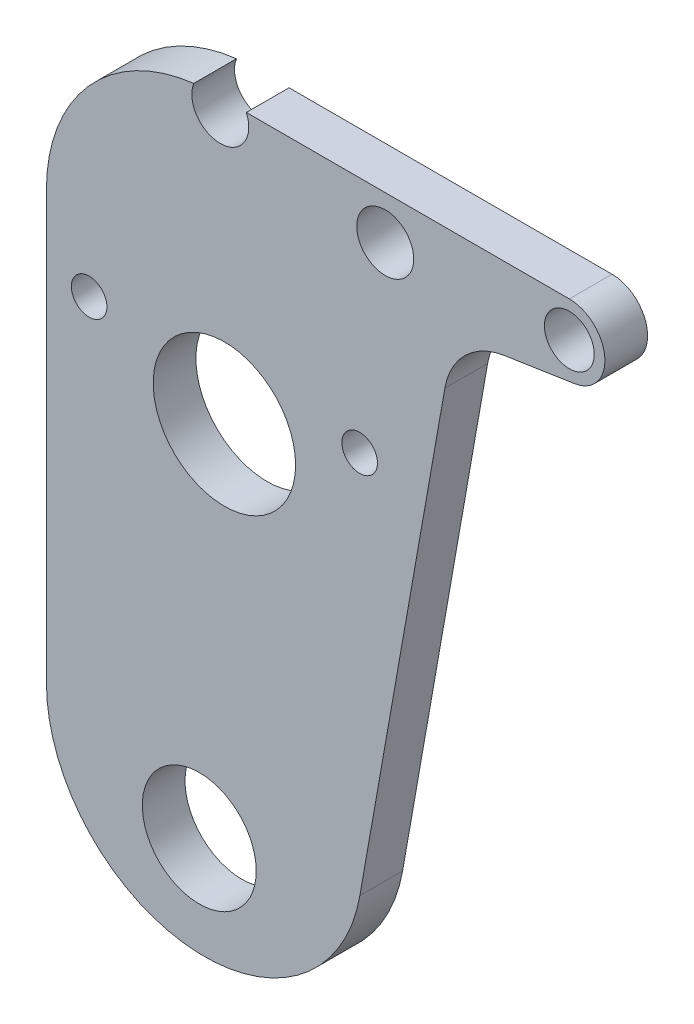
ISO-10303-21;
HEADER;
FILE_DESCRIPTION(('STEP AP214'),'2;1');
FILE_NAME('part.step','',(''),(''),'','','');
FILE_SCHEMA(('AUTOMOTIVE_DESIGN { 1 0 10303 214 1 1 1 1 }'));
ENDSEC;
DATA;
#1=APPLICATION_CONTEXT('core data for automotive mechanical design processes');
#2=APPLICATION_PROTOCOL_DEFINITION('international standard','automotive_design',2000,#1);
#3=PRODUCT_CONTEXT('',#1,'mechanical');
#4=PRODUCT('Part','Part','',(#3));
#5=PRODUCT_RELATED_PRODUCT_CATEGORY('part','',(#4));
#6=PRODUCT_DEFINITION_FORMATION('','',#4);
#7=PRODUCT_DEFINITION_CONTEXT('part definition',#1,'design');
#8=PRODUCT_DEFINITION('design','',#6,#7);
#9=PRODUCT_DEFINITION_SHAPE('','',#8);
#10=(LENGTH_UNIT() NAMED_UNIT(*) SI_UNIT(.MILLI.,.METRE.));
#11=(NAMED_UNIT(*) PLANE_ANGLE_UNIT() SI_UNIT($,.RADIAN.));
#12=(NAMED_UNIT(*) SI_UNIT($,.STERADIAN.) SOLID_ANGLE_UNIT());
#13=UNCERTAINTY_MEASURE_WITH_UNIT(LENGTH_MEASURE(1.E-05),#10,'distance_accuracy_value','');
#14=(GEOMETRIC_REPRESENTATION_CONTEXT(3) GLOBAL_UNCERTAINTY_ASSIGNED_CONTEXT((#13)) GLOBAL_UNIT_ASSIGNED_CONTEXT((#10,
#11,#12)) REPRESENTATION_CONTEXT('',''));
#15=CARTESIAN_POINT('',(0.,0.,0.));
#16=DIRECTION('',(0.,0.,1.));
#17=DIRECTION('',(1.,0.,0.));
#18=AXIS2_PLACEMENT_3D('',#15,#16,#17);
#19=CARTESIAN_POINT('',(-1.40800828095821,-15.,3.));
#20=DIRECTION('',(0.,0.,1.));
#21=DIRECTION('',(1.,0.,0.));
#22=AXIS2_PLACEMENT_3D('',#19,#20,#21);
#23=PLANE('',#22);
#24=CARTESIAN_POINT('',(11.2954093650333,23.6808514268258,3.));
#25=DIRECTION('',(0.,0.,1.));
#26=DIRECTION('',(1.,0.,0.));
#27=AXIS2_PLACEMENT_3D('',#24,#25,#26);
#28=CIRCLE('',#27,2.);
#29=CARTESIAN_POINT('',(13.2954093650333,23.6808514268258,3.));
#30=VERTEX_POINT('',#29);
#31=EDGE_CURVE('E228',#30,#30,#28,.T.);
#32=ORIENTED_EDGE('',*,*,#31,.F.);
#33=EDGE_LOOP('',(#32));
#34=FACE_BOUND('',#33,.T.);
#35=CARTESIAN_POINT('',(-0.289384277536325,25.9197319062456,3.));
#36=DIRECTION('',(0.,0.,1.));
#37=DIRECTION('',(1.,0.,0.));
#38=AXIS2_PLACEMENT_3D('',#35,#36,#37);
#39=CIRCLE('',#38,2.);
#40=CARTESIAN_POINT('',(-2.15403240396522,26.6429796954612,3.));
#41=VERTEX_POINT('',#40);
#42=CARTESIAN_POINT('',(1.54165475517068,26.7242790215244,3.));
#43=VERTEX_POINT('',#42);
#44=EDGE_CURVE('E225',#41,#43,#39,.T.);
#45=ORIENTED_EDGE('',*,*,#44,.F.);
#46=CARTESIAN_POINT('',(-0.775720978475638,15.,3.));
#47=DIRECTION('',(0.,0.,1.));
#48=DIRECTION('',(-1.,0.,0.));
#49=AXIS2_PLACEMENT_3D('',#46,#47,#48);
#50=CIRCLE('',#49,11.7242790215244);
#51=CARTESIAN_POINT('',(-12.5,15.,3.));
#52=VERTEX_POINT('',#51);
#53=EDGE_CURVE('E139',#41,#52,#50,.T.);
#54=ORIENTED_EDGE('',*,*,#53,.T.);
#55=DIRECTION('',(0.,-1.,0.));
#56=VECTOR('',#55,1.);
#57=CARTESIAN_POINT('',(-12.5,-15.,3.));
#58=LINE('',#57,#56);
#59=CARTESIAN_POINT('',(-12.5,-15.,3.));
#60=VERTEX_POINT('',#59);
#61=EDGE_CURVE('E60',#52,#60,#58,.T.);
#62=ORIENTED_EDGE('',*,*,#61,.T.);
#63=CARTESIAN_POINT('',(-1.40800828095821,-15.,3.));
#64=DIRECTION('',(0.,0.,1.));
#65=DIRECTION('',(1.,0.,0.));
#66=AXIS2_PLACEMENT_3D('',#63,#64,#65);
#67=CIRCLE('',#66,11.0919917190418);
#68=CARTESIAN_POINT('',(9.51547116030137,-16.9261041487082,3.));
#69=VERTEX_POINT('',#68);
#70=EDGE_CURVE('E162',#60,#69,#67,.T.);
#71=ORIENTED_EDGE('',*,*,#70,.T.);
#72=DIRECTION('',(0.173648177666924,0.984807753012209,0.));
#73=VECTOR('',#72,1.);
#74=CARTESIAN_POINT('',(15.4845288396986,16.9261041487082,3.));
#75=LINE('',#74,#73);
#76=CARTESIAN_POINT('',(15.4845288396986,16.9261041487082,3.));
#77=VERTEX_POINT('',#76);
#78=EDGE_CURVE('E99',#69,#77,#75,.T.);
#79=ORIENTED_EDGE('',*,*,#78,.T.);
#80=CARTESIAN_POINT('',(20.4085676047597,16.0578632603736,3.));
#81=DIRECTION('',(0.,0.,-1.));
#82=DIRECTION('',(1.,0.,0.));
#83=AXIS2_PLACEMENT_3D('',#80,#81,#82);
#84=CIRCLE('',#83,5.);
#85=CARTESIAN_POINT('',(19.6569218706047,21.0010432783708,3.));
#86=VERTEX_POINT('',#85);
#87=EDGE_CURVE('E188',#77,#86,#84,.T.);
#88=ORIENTED_EDGE('',*,*,#87,.T.);
#89=DIRECTION('',(0.988636003599436,0.150329146830999,0.));
#90=VECTOR('',#89,1.);
#91=CARTESIAN_POINT('',(24.6001018886019,21.7526890125258,3.));
#92=LINE('',#91,#90);
#93=CARTESIAN_POINT('',(24.6001018886019,21.7526890125258,3.));
#94=VERTEX_POINT('',#93);
#95=EDGE_CURVE('E120',#86,#94,#92,.T.);
#96=ORIENTED_EDGE('',*,*,#95,.T.);
#97=CARTESIAN_POINT('',(24.2242790215244,24.2242790215244,3.));
#98=DIRECTION('',(0.,0.,1.));
#99=DIRECTION('',(-1.,0.,0.));
#100=AXIS2_PLACEMENT_3D('',#97,#98,#99);
#101=CIRCLE('',#100,2.5);
#102=CARTESIAN_POINT('',(24.2242790215244,26.7242790215244,3.));
#103=VERTEX_POINT('',#102);
#104=EDGE_CURVE('E112',#94,#103,#101,.T.);
#105=ORIENTED_EDGE('',*,*,#104,.T.);
#106=DIRECTION('',(-1.,0.,0.));
#107=VECTOR('',#106,1.);
#108=CARTESIAN_POINT('',(-0.775720978475638,26.7242790215244,3.));
#109=LINE('',#108,#107);
#110=EDGE_CURVE('E118',#103,#43,#109,.T.);
#111=ORIENTED_EDGE('',*,*,#110,.T.);
#112=EDGE_LOOP('',(#45,#54,#62,#71,#79,#88,#96,#105,#111));
#113=FACE_BOUND('',#112,.T.);
#114=CARTESIAN_POINT('',(24.2242790215244,24.2242790215244,3.));
#115=DIRECTION('',(0.,0.,1.));
#116=DIRECTION('',(1.,0.,0.));
#117=AXIS2_PLACEMENT_3D('',#114,#115,#116);
#118=CIRCLE('',#117,1.75);
#119=CARTESIAN_POINT('',(25.9742790215244,24.2242790215244,3.));
#120=VERTEX_POINT('',#119);
#121=EDGE_CURVE('E217',#120,#120,#118,.T.);
#122=ORIENTED_EDGE('',*,*,#121,.F.);
#123=EDGE_LOOP('',(#122));
#124=FACE_BOUND('',#123,.T.);
#125=CARTESIAN_POINT('',(-9.5,10.,3.));
#126=DIRECTION('',(0.,0.,1.));
#127=DIRECTION('',(1.,0.,0.));
#128=AXIS2_PLACEMENT_3D('',#125,#126,#127);
#129=CIRCLE('',#128,1.25);
#130=CARTESIAN_POINT('',(-8.25,10.,3.));
#131=VERTEX_POINT('',#130);
#132=EDGE_CURVE('E212',#131,#131,#129,.T.);
#133=ORIENTED_EDGE('',*,*,#132,.F.);
#134=EDGE_LOOP('',(#133));
#135=FACE_BOUND('',#134,.T.);
#136=CARTESIAN_POINT('',(9.5,10.,3.));
#137=DIRECTION('',(0.,0.,1.));
#138=DIRECTION('',(1.,0.,0.));
#139=AXIS2_PLACEMENT_3D('',#136,#137,#138);
#140=CIRCLE('',#139,1.25);
#141=CARTESIAN_POINT('',(10.75,10.,3.));
#142=VERTEX_POINT('',#141);
#143=EDGE_CURVE('E209',#142,#142,#140,.T.);
#144=ORIENTED_EDGE('',*,*,#143,.F.);
#145=EDGE_LOOP('',(#144));
#146=FACE_BOUND('',#145,.T.);
#147=CARTESIAN_POINT('',(0.,7.,3.));
#148=DIRECTION('',(0.,0.,1.));
#149=DIRECTION('',(1.,0.,0.));
#150=AXIS2_PLACEMENT_3D('',#147,#148,#149);
#151=CIRCLE('',#150,5.);
#152=CARTESIAN_POINT('',(5.,7.,3.));
#153=VERTEX_POINT('',#152);
#154=EDGE_CURVE('E202',#153,#153,#151,.T.);
#155=ORIENTED_EDGE('',*,*,#154,.F.);
#156=EDGE_LOOP('',(#155));
#157=FACE_BOUND('',#156,.T.);
#158=CARTESIAN_POINT('',(-1.76464885854855,-19.0764204551448,3.));
#159=DIRECTION('',(0.,0.,1.));
#160=DIRECTION('',(1.,0.,0.));
#161=AXIS2_PLACEMENT_3D('',#158,#159,#160);
#162=CIRCLE('',#161,4.);
#163=CARTESIAN_POINT('',(2.23535114145145,-19.0764204551448,3.));
#164=VERTEX_POINT('',#163);
#165=EDGE_CURVE('E150',#164,#164,#162,.T.);
#166=ORIENTED_EDGE('',*,*,#165,.F.);
#167=EDGE_LOOP('',(#166));
#168=FACE_BOUND('',#167,.T.);
#169=ADVANCED_FACE('F37',(#34,#113,#124,#135,#146,#157,#168),#23,.T.);
#170=CARTESIAN_POINT('',(-1.40800828095821,-15.,0.));
#171=DIRECTION('',(0.,0.,1.));
#172=DIRECTION('',(1.,0.,0.));
#173=AXIS2_PLACEMENT_3D('',#170,#171,#172);
#174=PLANE('',#173);
#175=CARTESIAN_POINT('',(11.2954093650333,23.6808514268258,0.));
#176=DIRECTION('',(0.,0.,1.));
#177=DIRECTION('',(1.,0.,0.));
#178=AXIS2_PLACEMENT_3D('',#175,#176,#177);
#179=CIRCLE('',#178,2.);
#180=CARTESIAN_POINT('',(13.2954093650333,23.6808514268258,0.));
#181=VERTEX_POINT('',#180);
#182=EDGE_CURVE('E223',#181,#181,#179,.T.);
#183=ORIENTED_EDGE('',*,*,#182,.T.);
#184=EDGE_LOOP('',(#183));
#185=FACE_BOUND('',#184,.T.);
#186=CARTESIAN_POINT('',(24.2242790215244,24.2242790215244,0.));
#187=DIRECTION('',(0.,0.,1.));
#188=DIRECTION('',(1.,0.,0.));
#189=AXIS2_PLACEMENT_3D('',#186,#187,#188);
#190=CIRCLE('',#189,1.75);
#191=CARTESIAN_POINT('',(25.9742790215244,24.2242790215244,0.));
#192=VERTEX_POINT('',#191);
#193=EDGE_CURVE('E203',#192,#192,#190,.T.);
#194=ORIENTED_EDGE('',*,*,#193,.T.);
#195=EDGE_LOOP('',(#194));
#196=FACE_BOUND('',#195,.T.);
#197=CARTESIAN_POINT('',(-9.5,10.,0.));
#198=DIRECTION('',(0.,0.,1.));
#199=DIRECTION('',(1.,0.,0.));
#200=AXIS2_PLACEMENT_3D('',#197,#198,#199);
#201=CIRCLE('',#200,1.25);
#202=CARTESIAN_POINT('',(-8.25,10.,0.));
#203=VERTEX_POINT('',#202);
#204=EDGE_CURVE('E196',#203,#203,#201,.T.);
#205=ORIENTED_EDGE('',*,*,#204,.T.);
#206=EDGE_LOOP('',(#205));
#207=FACE_BOUND('',#206,.T.);
#208=CARTESIAN_POINT('',(9.5,10.,0.));
#209=DIRECTION('',(0.,0.,1.));
#210=DIRECTION('',(1.,0.,0.));
#211=AXIS2_PLACEMENT_3D('',#208,#209,#210);
#212=CIRCLE('',#211,1.25);
#213=CARTESIAN_POINT('',(10.75,10.,0.));
#214=VERTEX_POINT('',#213);
#215=EDGE_CURVE('E206',#214,#214,#212,.T.);
#216=ORIENTED_EDGE('',*,*,#215,.T.);
#217=EDGE_LOOP('',(#216));
#218=FACE_BOUND('',#217,.T.);
#219=CARTESIAN_POINT('',(0.,7.,0.));
#220=DIRECTION('',(0.,0.,1.));
#221=DIRECTION('',(1.,0.,0.));
#222=AXIS2_PLACEMENT_3D('',#219,#220,#221);
#223=CIRCLE('',#222,5.);
#224=CARTESIAN_POINT('',(5.,7.,0.));
#225=VERTEX_POINT('',#224);
#226=EDGE_CURVE('E199',#225,#225,#223,.T.);
#227=ORIENTED_EDGE('',*,*,#226,.T.);
#228=EDGE_LOOP('',(#227));
#229=FACE_BOUND('',#228,.T.);
#230=CARTESIAN_POINT('',(-0.775720978475638,15.,0.));
#231=DIRECTION('',(0.,0.,1.));
#232=DIRECTION('',(-1.,0.,0.));
#233=AXIS2_PLACEMENT_3D('',#230,#231,#232);
#234=CIRCLE('',#233,11.7242790215244);
#235=CARTESIAN_POINT('',(-2.15403240396522,26.6429796954612,0.));
#236=VERTEX_POINT('',#235);
#237=CARTESIAN_POINT('',(-12.5,15.,0.));
#238=VERTEX_POINT('',#237);
#239=EDGE_CURVE('E159',#236,#238,#234,.T.);
#240=ORIENTED_EDGE('',*,*,#239,.F.);
#241=CARTESIAN_POINT('',(-0.289384277536325,25.9197319062456,0.));
#242=DIRECTION('',(0.,0.,1.));
#243=DIRECTION('',(1.,0.,0.));
#244=AXIS2_PLACEMENT_3D('',#241,#242,#243);
#245=CIRCLE('',#244,2.);
#246=CARTESIAN_POINT('',(1.54165475517068,26.7242790215244,0.));
#247=VERTEX_POINT('',#246);
#248=EDGE_CURVE('E52',#236,#247,#245,.T.);
#249=ORIENTED_EDGE('',*,*,#248,.T.);
#250=DIRECTION('',(-1.,0.,0.));
#251=VECTOR('',#250,1.);
#252=CARTESIAN_POINT('',(-0.775720978475638,26.7242790215244,0.));
#253=LINE('',#252,#251);
#254=CARTESIAN_POINT('',(24.2242790215244,26.7242790215244,0.));
#255=VERTEX_POINT('',#254);
#256=EDGE_CURVE('E157',#255,#247,#253,.T.);
#257=ORIENTED_EDGE('',*,*,#256,.F.);
#258=CARTESIAN_POINT('',(24.2242790215244,24.2242790215244,0.));
#259=DIRECTION('',(0.,0.,1.));
#260=DIRECTION('',(-1.,0.,0.));
#261=AXIS2_PLACEMENT_3D('',#258,#259,#260);
#262=CIRCLE('',#261,2.5);
#263=CARTESIAN_POINT('',(24.6001018886019,21.7526890125258,0.));
#264=VERTEX_POINT('',#263);
#265=EDGE_CURVE('E129',#264,#255,#262,.T.);
#266=ORIENTED_EDGE('',*,*,#265,.F.);
#267=DIRECTION('',(0.988636003599436,0.150329146830999,0.));
#268=VECTOR('',#267,1.);
#269=CARTESIAN_POINT('',(24.6001018886019,21.7526890125258,0.));
#270=LINE('',#269,#268);
#271=CARTESIAN_POINT('',(19.6569218706047,21.0010432783708,0.));
#272=VERTEX_POINT('',#271);
#273=EDGE_CURVE('E154',#272,#264,#270,.T.);
#274=ORIENTED_EDGE('',*,*,#273,.F.);
#275=CARTESIAN_POINT('',(20.4085676047597,16.0578632603736,0.));
#276=DIRECTION('',(0.,0.,-1.));
#277=DIRECTION('',(1.,0.,0.));
#278=AXIS2_PLACEMENT_3D('',#275,#276,#277);
#279=CIRCLE('',#278,5.);
#280=CARTESIAN_POINT('',(15.4845288396986,16.9261041487082,0.));
#281=VERTEX_POINT('',#280);
#282=EDGE_CURVE('E152',#281,#272,#279,.T.);
#283=ORIENTED_EDGE('',*,*,#282,.F.);
#284=DIRECTION('',(0.173648177666924,0.984807753012209,0.));
#285=VECTOR('',#284,1.);
#286=CARTESIAN_POINT('',(15.4845288396986,16.9261041487082,0.));
#287=LINE('',#286,#285);
#288=CARTESIAN_POINT('',(9.51547116030137,-16.9261041487082,0.));
#289=VERTEX_POINT('',#288);
#290=EDGE_CURVE('E149',#289,#281,#287,.T.);
#291=ORIENTED_EDGE('',*,*,#290,.F.);
#292=CARTESIAN_POINT('',(-1.40800828095821,-15.,0.));
#293=DIRECTION('',(0.,0.,1.));
#294=DIRECTION('',(1.,0.,0.));
#295=AXIS2_PLACEMENT_3D('',#292,#293,#294);
#296=CIRCLE('',#295,11.0919917190418);
#297=CARTESIAN_POINT('',(-12.5,-15.,0.));
#298=VERTEX_POINT('',#297);
#299=EDGE_CURVE('E146',#298,#289,#296,.T.);
#300=ORIENTED_EDGE('',*,*,#299,.F.);
#301=DIRECTION('',(0.,-1.,0.));
#302=VECTOR('',#301,1.);
#303=CARTESIAN_POINT('',(-12.5,-15.,0.));
#304=LINE('',#303,#302);
#305=EDGE_CURVE('E90',#238,#298,#304,.T.);
#306=ORIENTED_EDGE('',*,*,#305,.F.);
#307=EDGE_LOOP('',(#240,#249,#257,#266,#274,#283,#291,#300,#306));
#308=FACE_BOUND('',#307,.T.);
#309=CARTESIAN_POINT('',(-1.76464885854855,-19.0764204551448,0.));
#310=DIRECTION('',(0.,0.,1.));
#311=DIRECTION('',(1.,0.,0.));
#312=AXIS2_PLACEMENT_3D('',#309,#310,#311);
#313=CIRCLE('',#312,4.);
#314=CARTESIAN_POINT('',(2.23535114145145,-19.0764204551448,0.));
#315=VERTEX_POINT('',#314);
#316=EDGE_CURVE('E193',#315,#315,#313,.T.);
#317=ORIENTED_EDGE('',*,*,#316,.T.);
#318=EDGE_LOOP('',(#317));
#319=FACE_BOUND('',#318,.T.);
#320=ADVANCED_FACE('F178',(#185,#196,#207,#218,#229,#308,#319),#174,.F.);
#321=CARTESIAN_POINT('',(-1.40800828095821,-15.,3.));
#322=DIRECTION('',(0.,0.,-1.));
#323=DIRECTION('',(-1.,0.,0.));
#324=AXIS2_PLACEMENT_3D('',#321,#322,#323);
#325=CYLINDRICAL_SURFACE('',#324,11.0919917190418);
#326=ORIENTED_EDGE('',*,*,#299,.T.);
#327=DIRECTION('',(0.,0.,-1.));
#328=VECTOR('',#327,1.);
#329=CARTESIAN_POINT('',(9.51547116030137,-16.9261041487082,3.));
#330=LINE('',#329,#328);
#331=EDGE_CURVE('E45',#69,#289,#330,.T.);
#332=ORIENTED_EDGE('',*,*,#331,.F.);
#333=ORIENTED_EDGE('',*,*,#70,.F.);
#334=DIRECTION('',(0.,0.,-1.));
#335=VECTOR('',#334,1.);
#336=CARTESIAN_POINT('',(-12.5,-15.,3.));
#337=LINE('',#336,#335);
#338=EDGE_CURVE('E145',#60,#298,#337,.T.);
#339=ORIENTED_EDGE('',*,*,#338,.T.);
#340=EDGE_LOOP('',(#326,#332,#333,#339));
#341=FACE_BOUND('',#340,.T.);
#342=ADVANCED_FACE('F39',(#341),#325,.T.);
#343=CARTESIAN_POINT('',(15.4845288396986,16.9261041487082,3.));
#344=DIRECTION('',(-0.984807753012209,0.173648177666924,0.));
#345=DIRECTION('',(-0.173648177666924,-0.984807753012209,0.));
#346=AXIS2_PLACEMENT_3D('',#343,#344,#345);
#347=PLANE('',#346);
#348=ORIENTED_EDGE('',*,*,#290,.T.);
#349=DIRECTION('',(0.,0.,-1.));
#350=VECTOR('',#349,1.);
#351=CARTESIAN_POINT('',(15.4845288396986,16.9261041487082,3.));
#352=LINE('',#351,#350);
#353=EDGE_CURVE('E169',#77,#281,#352,.T.);
#354=ORIENTED_EDGE('',*,*,#353,.F.);
#355=ORIENTED_EDGE('',*,*,#78,.F.);
#356=ORIENTED_EDGE('',*,*,#331,.T.);
#357=EDGE_LOOP('',(#348,#354,#355,#356));
#358=FACE_BOUND('',#357,.T.);
#359=ADVANCED_FACE('F172',(#358),#347,.F.);
#360=CARTESIAN_POINT('',(20.4085676047597,16.0578632603736,3.));
#361=DIRECTION('',(0.,0.,-1.));
#362=DIRECTION('',(-1.,0.,0.));
#363=AXIS2_PLACEMENT_3D('',#360,#361,#362);
#364=CYLINDRICAL_SURFACE('',#363,5.);
#365=ORIENTED_EDGE('',*,*,#282,.T.);
#366=DIRECTION('',(0.,0.,-1.));
#367=VECTOR('',#366,1.);
#368=CARTESIAN_POINT('',(19.6569218706047,21.0010432783708,3.));
#369=LINE('',#368,#367);
#370=EDGE_CURVE('E166',#86,#272,#369,.T.);
#371=ORIENTED_EDGE('',*,*,#370,.F.);
#372=ORIENTED_EDGE('',*,*,#87,.F.);
#373=ORIENTED_EDGE('',*,*,#353,.T.);
#374=EDGE_LOOP('',(#365,#371,#372,#373));
#375=FACE_BOUND('',#374,.T.);
#376=ADVANCED_FACE('F184',(#375),#364,.F.);
#377=CARTESIAN_POINT('',(24.6001018886019,21.7526890125258,3.));
#378=DIRECTION('',(-0.150329146830999,0.988636003599436,0.));
#379=DIRECTION('',(-0.988636003599436,-0.150329146830999,0.));
#380=AXIS2_PLACEMENT_3D('',#377,#378,#379);
#381=PLANE('',#380);
#382=ORIENTED_EDGE('',*,*,#273,.T.);
#383=DIRECTION('',(0.,0.,-1.));
#384=VECTOR('',#383,1.);
#385=CARTESIAN_POINT('',(24.6001018886019,21.7526890125258,3.));
#386=LINE('',#385,#384);
#387=EDGE_CURVE('E133',#94,#264,#386,.T.);
#388=ORIENTED_EDGE('',*,*,#387,.F.);
#389=ORIENTED_EDGE('',*,*,#95,.F.);
#390=ORIENTED_EDGE('',*,*,#370,.T.);
#391=EDGE_LOOP('',(#382,#388,#389,#390));
#392=FACE_BOUND('',#391,.T.);
#393=ADVANCED_FACE('F187',(#392),#381,.F.);
#394=CARTESIAN_POINT('',(24.2242790215244,24.2242790215244,3.));
#395=DIRECTION('',(0.,0.,-1.));
#396=DIRECTION('',(-1.,0.,0.));
#397=AXIS2_PLACEMENT_3D('',#394,#395,#396);
#398=CYLINDRICAL_SURFACE('',#397,2.5);
#399=ORIENTED_EDGE('',*,*,#265,.T.);
#400=DIRECTION('',(0.,0.,-1.));
#401=VECTOR('',#400,1.);
#402=CARTESIAN_POINT('',(24.2242790215244,26.7242790215244,3.));
#403=LINE('',#402,#401);
#404=EDGE_CURVE('E126',#103,#255,#403,.T.);
#405=ORIENTED_EDGE('',*,*,#404,.F.);
#406=ORIENTED_EDGE('',*,*,#104,.F.);
#407=ORIENTED_EDGE('',*,*,#387,.T.);
#408=EDGE_LOOP('',(#399,#405,#406,#407));
#409=FACE_BOUND('',#408,.T.);
#410=ADVANCED_FACE('F127',(#409),#398,.T.);
#411=CARTESIAN_POINT('',(-0.775720978475638,26.7242790215244,3.));
#412=DIRECTION('',(0.,-1.,0.));
#413=DIRECTION('',(0.,0.,-1.));
#414=AXIS2_PLACEMENT_3D('',#411,#412,#413);
#415=PLANE('',#414);
#416=ORIENTED_EDGE('',*,*,#256,.T.);
#417=DIRECTION('',(0.,0.,1.));
#418=VECTOR('',#417,1.);
#419=CARTESIAN_POINT('',(1.54165475517068,26.7242790215244,0.));
#420=LINE('',#419,#418);
#421=EDGE_CURVE('E138',#247,#43,#420,.T.);
#422=ORIENTED_EDGE('',*,*,#421,.T.);
#423=ORIENTED_EDGE('',*,*,#110,.F.);
#424=ORIENTED_EDGE('',*,*,#404,.T.);
#425=EDGE_LOOP('',(#416,#422,#423,#424));
#426=FACE_BOUND('',#425,.T.);
#427=ADVANCED_FACE('F137',(#426),#415,.F.);
#428=CARTESIAN_POINT('',(-0.775720978475638,15.,3.));
#429=DIRECTION('',(0.,0.,-1.));
#430=DIRECTION('',(-1.,0.,0.));
#431=AXIS2_PLACEMENT_3D('',#428,#429,#430);
#432=CYLINDRICAL_SURFACE('',#431,11.7242790215244);
#433=ORIENTED_EDGE('',*,*,#53,.F.);
#434=DIRECTION('',(0.,0.,1.));
#435=VECTOR('',#434,1.);
#436=CARTESIAN_POINT('',(-2.15403240396521,26.6429796954612,1.5));
#437=LINE('',#436,#435);
#438=EDGE_CURVE('E11',#41,#236,#437,.F.);
#439=ORIENTED_EDGE('',*,*,#438,.T.);
#440=ORIENTED_EDGE('',*,*,#239,.T.);
#441=DIRECTION('',(0.,0.,-1.));
#442=VECTOR('',#441,1.);
#443=CARTESIAN_POINT('',(-12.5,15.,3.));
#444=LINE('',#443,#442);
#445=EDGE_CURVE('E134',#52,#238,#444,.T.);
#446=ORIENTED_EDGE('',*,*,#445,.F.);
#447=EDGE_LOOP('',(#433,#439,#440,#446));
#448=FACE_BOUND('',#447,.T.);
#449=ADVANCED_FACE('F256',(#448),#432,.T.);
#450=CARTESIAN_POINT('',(-12.5,-15.,3.));
#451=DIRECTION('',(1.,0.,0.));
#452=DIRECTION('',(0.,1.,0.));
#453=AXIS2_PLACEMENT_3D('',#450,#451,#452);
#454=PLANE('',#453);
#455=ORIENTED_EDGE('',*,*,#305,.T.);
#456=ORIENTED_EDGE('',*,*,#338,.F.);
#457=ORIENTED_EDGE('',*,*,#61,.F.);
#458=ORIENTED_EDGE('',*,*,#445,.T.);
#459=EDGE_LOOP('',(#455,#456,#457,#458));
#460=FACE_BOUND('',#459,.T.);
#461=ADVANCED_FACE('F253',(#460),#454,.F.);
#462=CARTESIAN_POINT('',(-1.76464885854855,-19.0764204551448,3.));
#463=DIRECTION('',(0.,0.,-1.));
#464=DIRECTION('',(-1.,0.,0.));
#465=AXIS2_PLACEMENT_3D('',#462,#463,#464);
#466=CYLINDRICAL_SURFACE('',#465,4.);
#467=ORIENTED_EDGE('',*,*,#165,.T.);
#468=EDGE_LOOP('',(#467));
#469=FACE_BOUND('',#468,.T.);
#470=ORIENTED_EDGE('',*,*,#316,.F.);
#471=EDGE_LOOP('',(#470));
#472=FACE_BOUND('',#471,.T.);
#473=ADVANCED_FACE('F250',(#469,#472),#466,.F.);
#474=CARTESIAN_POINT('',(0.,7.,0.));
#475=DIRECTION('',(0.,0.,1.));
#476=DIRECTION('',(1.,0.,0.));
#477=AXIS2_PLACEMENT_3D('',#474,#475,#476);
#478=CYLINDRICAL_SURFACE('',#477,5.);
#479=ORIENTED_EDGE('',*,*,#226,.F.);
#480=EDGE_LOOP('',(#479));
#481=FACE_BOUND('',#480,.T.);
#482=ORIENTED_EDGE('',*,*,#154,.T.);
#483=EDGE_LOOP('',(#482));
#484=FACE_BOUND('',#483,.T.);
#485=ADVANCED_FACE('F344',(#481,#484),#478,.F.);
#486=CARTESIAN_POINT('',(9.5,10.,0.));
#487=DIRECTION('',(0.,0.,1.));
#488=DIRECTION('',(1.,0.,0.));
#489=AXIS2_PLACEMENT_3D('',#486,#487,#488);
#490=CYLINDRICAL_SURFACE('',#489,1.25);
#491=ORIENTED_EDGE('',*,*,#215,.F.);
#492=EDGE_LOOP('',(#491));
#493=FACE_BOUND('',#492,.T.);
#494=ORIENTED_EDGE('',*,*,#143,.T.);
#495=EDGE_LOOP('',(#494));
#496=FACE_BOUND('',#495,.T.);
#497=ADVANCED_FACE('F334',(#493,#496),#490,.F.);
#498=CARTESIAN_POINT('',(-9.5,10.,0.));
#499=DIRECTION('',(0.,0.,1.));
#500=DIRECTION('',(1.,0.,0.));
#501=AXIS2_PLACEMENT_3D('',#498,#499,#500);
#502=CYLINDRICAL_SURFACE('',#501,1.25);
#503=ORIENTED_EDGE('',*,*,#204,.F.);
#504=EDGE_LOOP('',(#503));
#505=FACE_BOUND('',#504,.T.);
#506=ORIENTED_EDGE('',*,*,#132,.T.);
#507=EDGE_LOOP('',(#506));
#508=FACE_BOUND('',#507,.T.);
#509=ADVANCED_FACE('F325',(#505,#508),#502,.F.);
#510=CARTESIAN_POINT('',(24.2242790215244,24.2242790215244,0.));
#511=DIRECTION('',(0.,0.,1.));
#512=DIRECTION('',(1.,0.,0.));
#513=AXIS2_PLACEMENT_3D('',#510,#511,#512);
#514=CYLINDRICAL_SURFACE('',#513,1.75);
#515=ORIENTED_EDGE('',*,*,#193,.F.);
#516=EDGE_LOOP('',(#515));
#517=FACE_BOUND('',#516,.T.);
#518=ORIENTED_EDGE('',*,*,#121,.T.);
#519=EDGE_LOOP('',(#518));
#520=FACE_BOUND('',#519,.T.);
#521=ADVANCED_FACE('F306',(#517,#520),#514,.F.);
#522=CARTESIAN_POINT('',(-0.289384277536325,25.9197319062456,0.));
#523=DIRECTION('',(0.,0.,1.));
#524=DIRECTION('',(1.,0.,0.));
#525=AXIS2_PLACEMENT_3D('',#522,#523,#524);
#526=CYLINDRICAL_SURFACE('',#525,2.);
#527=ORIENTED_EDGE('',*,*,#248,.F.);
#528=ORIENTED_EDGE('',*,*,#438,.F.);
#529=ORIENTED_EDGE('',*,*,#44,.T.);
#530=ORIENTED_EDGE('',*,*,#421,.F.);
#531=EDGE_LOOP('',(#527,#528,#529,#530));
#532=FACE_BOUND('',#531,.T.);
#533=ADVANCED_FACE('F239',(#532),#526,.F.);
#534=CARTESIAN_POINT('',(11.2954093650333,23.6808514268258,0.));
#535=DIRECTION('',(0.,0.,1.));
#536=DIRECTION('',(1.,0.,0.));
#537=AXIS2_PLACEMENT_3D('',#534,#535,#536);
#538=CYLINDRICAL_SURFACE('',#537,2.);
#539=ORIENTED_EDGE('',*,*,#182,.F.);
#540=EDGE_LOOP('',(#539));
#541=FACE_BOUND('',#540,.T.);
#542=ORIENTED_EDGE('',*,*,#31,.T.);
#543=EDGE_LOOP('',(#542));
#544=FACE_BOUND('',#543,.T.);
#545=ADVANCED_FACE('F236',(#541,#544),#538,.F.);
#546=CLOSED_SHELL('',(#169,#320,#342,#359,#376,#393,#410,#427,#449,#461,#473,#485,#497,#509,
#521,#533,#545));
#547=MANIFOLD_SOLID_BREP('B2',#546);
#548=ADVANCED_BREP_SHAPE_REPRESENTATION('',(#18,#547),#14);
#549=SHAPE_DEFINITION_REPRESENTATION(#9,#548);
ENDSEC;
END-ISO-10303-21;
